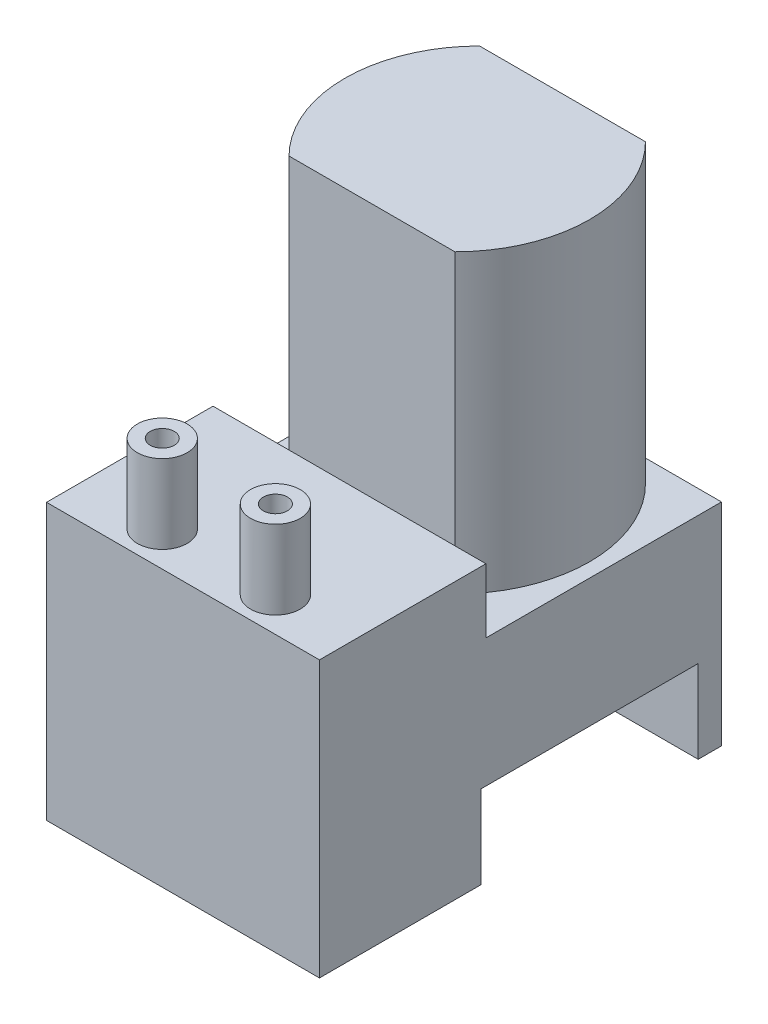
ISO-10303-21;
HEADER;
FILE_DESCRIPTION(('STEP AP214'),'2;1');
FILE_NAME('part.step','',(''),(''),'','','');
FILE_SCHEMA(('AUTOMOTIVE_DESIGN { 1 0 10303 214 1 1 1 1 }'));
ENDSEC;
DATA;
#1=APPLICATION_CONTEXT('core data for automotive mechanical design processes');
#2=APPLICATION_PROTOCOL_DEFINITION('international standard','automotive_design',2000,#1);
#3=PRODUCT_CONTEXT('',#1,'mechanical');
#4=PRODUCT('Part','Part','',(#3));
#5=PRODUCT_RELATED_PRODUCT_CATEGORY('part','',(#4));
#6=PRODUCT_DEFINITION_FORMATION('','',#4);
#7=PRODUCT_DEFINITION_CONTEXT('part definition',#1,'design');
#8=PRODUCT_DEFINITION('design','',#6,#7);
#9=PRODUCT_DEFINITION_SHAPE('','',#8);
#10=(LENGTH_UNIT() NAMED_UNIT(*) SI_UNIT(.MILLI.,.METRE.));
#11=(NAMED_UNIT(*) PLANE_ANGLE_UNIT() SI_UNIT($,.RADIAN.));
#12=(NAMED_UNIT(*) SI_UNIT($,.STERADIAN.) SOLID_ANGLE_UNIT());
#13=UNCERTAINTY_MEASURE_WITH_UNIT(LENGTH_MEASURE(1.E-05),#10,'distance_accuracy_value','');
#14=(GEOMETRIC_REPRESENTATION_CONTEXT(3) GLOBAL_UNCERTAINTY_ASSIGNED_CONTEXT((#13)) GLOBAL_UNIT_ASSIGNED_CONTEXT((#10,
#11,#12)) REPRESENTATION_CONTEXT('',''));
#15=CARTESIAN_POINT('',(0.,0.,0.));
#16=DIRECTION('',(0.,0.,1.));
#17=DIRECTION('',(1.,0.,0.));
#18=AXIS2_PLACEMENT_3D('',#15,#16,#17);
#19=CARTESIAN_POINT('',(8.501,4.58,0.));
#20=DIRECTION('',(0.,-1.,0.));
#21=DIRECTION('',(1.,0.,0.));
#22=AXIS2_PLACEMENT_3D('',#19,#20,#21);
#23=PLANE('',#22);
#24=DIRECTION('',(0.,0.,-1.));
#25=VECTOR('',#24,1.);
#26=CARTESIAN_POINT('',(8.5,4.58,0.));
#27=LINE('',#26,#25);
#28=CARTESIAN_POINT('',(8.5,4.58,14.67));
#29=VERTEX_POINT('',#28);
#30=CARTESIAN_POINT('',(8.5,4.58,0.));
#31=VERTEX_POINT('',#30);
#32=EDGE_CURVE('E221',#29,#31,#27,.T.);
#33=ORIENTED_EDGE('',*,*,#32,.T.);
#34=DIRECTION('',(-1.,0.,0.));
#35=VECTOR('',#34,1.);
#36=CARTESIAN_POINT('',(8.501,4.58,0.));
#37=LINE('',#36,#35);
#38=CARTESIAN_POINT('',(-8.5,4.58,0.));
#39=VERTEX_POINT('',#38);
#40=EDGE_CURVE('E217',#31,#39,#37,.T.);
#41=ORIENTED_EDGE('',*,*,#40,.T.);
#42=DIRECTION('',(0.,0.,1.));
#43=VECTOR('',#42,1.);
#44=CARTESIAN_POINT('',(-8.5,4.58,0.));
#45=LINE('',#44,#43);
#46=CARTESIAN_POINT('',(-8.5,4.58,14.67));
#47=VERTEX_POINT('',#46);
#48=EDGE_CURVE('E212',#39,#47,#45,.T.);
#49=ORIENTED_EDGE('',*,*,#48,.T.);
#50=DIRECTION('',(-1.,0.,0.));
#51=VECTOR('',#50,1.);
#52=CARTESIAN_POINT('',(8.501,4.58,14.67));
#53=LINE('',#52,#51);
#54=EDGE_CURVE('E222',#29,#47,#53,.T.);
#55=ORIENTED_EDGE('',*,*,#54,.F.);
#56=EDGE_LOOP('',(#33,#41,#49,#55));
#57=FACE_BOUND('',#56,.T.);
#58=CARTESIAN_POINT('',(0.770000000000004,4.58,7.335));
#59=DIRECTION('',(0.,1.,0.));
#60=DIRECTION('',(1.,0.,0.));
#61=AXIS2_PLACEMENT_3D('',#58,#59,#60);
#62=CIRCLE('',#61,8.39335749268433);
#63=CARTESIAN_POINT('',(-5.16500000000001,4.58,1.4));
#64=VERTEX_POINT('',#63);
#65=CARTESIAN_POINT('',(-5.165,4.58,13.27));
#66=VERTEX_POINT('',#65);
#67=EDGE_CURVE('E175',#64,#66,#62,.T.);
#68=ORIENTED_EDGE('',*,*,#67,.F.);
#69=DIRECTION('',(-1.,0.,0.));
#70=VECTOR('',#69,1.);
#71=CARTESIAN_POINT('',(5.16499999999999,4.58,1.4));
#72=LINE('',#71,#70);
#73=CARTESIAN_POINT('',(5.165,4.58,1.4));
#74=VERTEX_POINT('',#73);
#75=EDGE_CURVE('E172',#74,#64,#72,.T.);
#76=ORIENTED_EDGE('',*,*,#75,.F.);
#77=CARTESIAN_POINT('',(-0.769999999999997,4.58,7.335));
#78=DIRECTION('',(0.,1.,0.));
#79=DIRECTION('',(-1.,0.,0.));
#80=AXIS2_PLACEMENT_3D('',#77,#78,#79);
#81=CIRCLE('',#80,8.39335749268431);
#82=CARTESIAN_POINT('',(5.165,4.58000000000001,13.27));
#83=VERTEX_POINT('',#82);
#84=EDGE_CURVE('E53',#83,#74,#81,.T.);
#85=ORIENTED_EDGE('',*,*,#84,.F.);
#86=DIRECTION('',(1.,0.,0.));
#87=VECTOR('',#86,1.);
#88=CARTESIAN_POINT('',(5.165,4.58,13.27));
#89=LINE('',#88,#87);
#90=EDGE_CURVE('E48',#66,#83,#89,.T.);
#91=ORIENTED_EDGE('',*,*,#90,.F.);
#92=EDGE_LOOP('',(#68,#76,#85,#91));
#93=FACE_BOUND('',#92,.T.);
#94=ADVANCED_FACE('F33',(#57,#93),#23,.F.);
#95=CARTESIAN_POINT('',(-8.5,-8.58,25.04));
#96=DIRECTION('',(0.,1.,0.));
#97=DIRECTION('',(0.,0.,1.));
#98=AXIS2_PLACEMENT_3D('',#95,#96,#97);
#99=PLANE('',#98);
#100=DIRECTION('',(0.,0.,-1.));
#101=VECTOR('',#100,1.);
#102=CARTESIAN_POINT('',(8.5,-8.58,25.04));
#103=LINE('',#102,#101);
#104=CARTESIAN_POINT('',(8.5,-8.58,1.45));
#105=VERTEX_POINT('',#104);
#106=CARTESIAN_POINT('',(8.5,-8.58,0.));
#107=VERTEX_POINT('',#106);
#108=EDGE_CURVE('E278',#105,#107,#103,.T.);
#109=ORIENTED_EDGE('',*,*,#108,.F.);
#110=DIRECTION('',(1.,0.,0.));
#111=VECTOR('',#110,1.);
#112=CARTESIAN_POINT('',(8.5,-8.58,1.45));
#113=LINE('',#112,#111);
#114=CARTESIAN_POINT('',(-8.5,-8.58,1.45));
#115=VERTEX_POINT('',#114);
#116=EDGE_CURVE('E231',#115,#105,#113,.T.);
#117=ORIENTED_EDGE('',*,*,#116,.F.);
#118=DIRECTION('',(0.,0.,-1.));
#119=VECTOR('',#118,1.);
#120=CARTESIAN_POINT('',(-8.5,-8.58,25.04));
#121=LINE('',#120,#119);
#122=CARTESIAN_POINT('',(-8.5,-8.58,0.));
#123=VERTEX_POINT('',#122);
#124=EDGE_CURVE('E288',#115,#123,#121,.T.);
#125=ORIENTED_EDGE('',*,*,#124,.T.);
#126=DIRECTION('',(1.,0.,0.));
#127=VECTOR('',#126,1.);
#128=CARTESIAN_POINT('',(-8.5,-8.58,0.));
#129=LINE('',#128,#127);
#130=EDGE_CURVE('E272',#123,#107,#129,.T.);
#131=ORIENTED_EDGE('',*,*,#130,.T.);
#132=EDGE_LOOP('',(#109,#117,#125,#131));
#133=FACE_BOUND('',#132,.T.);
#134=ADVANCED_FACE('F345',(#133),#99,.F.);
#135=CARTESIAN_POINT('',(8.5,8.58,25.04));
#136=DIRECTION('',(-1.,0.,0.));
#137=DIRECTION('',(0.,-1.,0.));
#138=AXIS2_PLACEMENT_3D('',#135,#136,#137);
#139=PLANE('',#138);
#140=ORIENTED_EDGE('',*,*,#32,.F.);
#141=DIRECTION('',(0.,-1.,0.));
#142=VECTOR('',#141,1.);
#143=CARTESIAN_POINT('',(8.5,8.58,14.67));
#144=LINE('',#143,#142);
#145=CARTESIAN_POINT('',(8.5,8.58,14.67));
#146=VERTEX_POINT('',#145);
#147=EDGE_CURVE('E205',#146,#29,#144,.T.);
#148=ORIENTED_EDGE('',*,*,#147,.F.);
#149=DIRECTION('',(0.,0.,-1.));
#150=VECTOR('',#149,1.);
#151=CARTESIAN_POINT('',(8.5,8.58,25.04));
#152=LINE('',#151,#150);
#153=CARTESIAN_POINT('',(8.5,8.58,25.04));
#154=VERTEX_POINT('',#153);
#155=EDGE_CURVE('E295',#154,#146,#152,.T.);
#156=ORIENTED_EDGE('',*,*,#155,.F.);
#157=DIRECTION('',(0.,1.,0.));
#158=VECTOR('',#157,1.);
#159=CARTESIAN_POINT('',(8.5,8.58,25.04));
#160=LINE('',#159,#158);
#161=CARTESIAN_POINT('',(8.5,-8.58,25.04));
#162=VERTEX_POINT('',#161);
#163=EDGE_CURVE('E268',#162,#154,#160,.T.);
#164=ORIENTED_EDGE('',*,*,#163,.F.);
#165=CARTESIAN_POINT('',(8.5,-8.58,14.97));
#166=VERTEX_POINT('',#165);
#167=EDGE_CURVE('E285',#162,#166,#103,.T.);
#168=ORIENTED_EDGE('',*,*,#167,.T.);
#169=DIRECTION('',(0.,-1.,0.));
#170=VECTOR('',#169,1.);
#171=CARTESIAN_POINT('',(8.5,-3.41,14.97));
#172=LINE('',#171,#170);
#173=CARTESIAN_POINT('',(8.5,-3.41,14.97));
#174=VERTEX_POINT('',#173);
#175=EDGE_CURVE('E237',#174,#166,#172,.T.);
#176=ORIENTED_EDGE('',*,*,#175,.F.);
#177=DIRECTION('',(0.,0.,1.));
#178=VECTOR('',#177,1.);
#179=CARTESIAN_POINT('',(8.5,-3.41,1.45));
#180=LINE('',#179,#178);
#181=CARTESIAN_POINT('',(8.5,-3.41,1.45));
#182=VERTEX_POINT('',#181);
#183=EDGE_CURVE('E227',#182,#174,#180,.T.);
#184=ORIENTED_EDGE('',*,*,#183,.F.);
#185=DIRECTION('',(0.,-1.,0.));
#186=VECTOR('',#185,1.);
#187=CARTESIAN_POINT('',(8.5,-3.41,1.45));
#188=LINE('',#187,#186);
#189=EDGE_CURVE('E240',#182,#105,#188,.T.);
#190=ORIENTED_EDGE('',*,*,#189,.T.);
#191=ORIENTED_EDGE('',*,*,#108,.T.);
#192=DIRECTION('',(0.,1.,0.));
#193=VECTOR('',#192,1.);
#194=CARTESIAN_POINT('',(8.5,8.58,0.));
#195=LINE('',#194,#193);
#196=EDGE_CURVE('E267',#107,#31,#195,.T.);
#197=ORIENTED_EDGE('',*,*,#196,.T.);
#198=EDGE_LOOP('',(#140,#148,#156,#164,#168,#176,#184,#190,#191,#197));
#199=FACE_BOUND('',#198,.T.);
#200=ADVANCED_FACE('F35',(#199),#139,.F.);
#201=CARTESIAN_POINT('',(-8.5,8.58,25.04));
#202=DIRECTION('',(0.,-1.,0.));
#203=DIRECTION('',(0.,0.,-1.));
#204=AXIS2_PLACEMENT_3D('',#201,#202,#203);
#205=PLANE('',#204);
#206=CARTESIAN_POINT('',(-3.44656333273186,8.58,22.884960512398));
#207=DIRECTION('',(0.,-1.,0.));
#208=DIRECTION('',(0.,0.,-1.));
#209=AXIS2_PLACEMENT_3D('',#206,#207,#208);
#210=CIRCLE('',#209,1.55);
#211=CARTESIAN_POINT('',(-3.44656333273186,8.58,21.334960512398));
#212=VERTEX_POINT('',#211);
#213=EDGE_CURVE('E11',#212,#212,#210,.F.);
#214=ORIENTED_EDGE('',*,*,#213,.F.);
#215=EDGE_LOOP('',(#214));
#216=FACE_BOUND('',#215,.T.);
#217=CARTESIAN_POINT('',(3.61628527304703,8.58,22.901678995054));
#218=DIRECTION('',(0.,-1.,0.));
#219=DIRECTION('',(0.,0.,-1.));
#220=AXIS2_PLACEMENT_3D('',#217,#218,#219);
#221=CIRCLE('',#220,1.55);
#222=CARTESIAN_POINT('',(3.61628527304703,8.58,21.351678995054));
#223=VERTEX_POINT('',#222);
#224=EDGE_CURVE('E41',#223,#223,#221,.F.);
#225=ORIENTED_EDGE('',*,*,#224,.F.);
#226=EDGE_LOOP('',(#225));
#227=FACE_BOUND('',#226,.T.);
#228=ORIENTED_EDGE('',*,*,#155,.T.);
#229=DIRECTION('',(-1.,0.,0.));
#230=VECTOR('',#229,1.);
#231=CARTESIAN_POINT('',(8.501,8.58,14.67));
#232=LINE('',#231,#230);
#233=CARTESIAN_POINT('',(-8.5,8.58,14.67));
#234=VERTEX_POINT('',#233);
#235=EDGE_CURVE('E218',#146,#234,#232,.T.);
#236=ORIENTED_EDGE('',*,*,#235,.T.);
#237=DIRECTION('',(0.,0.,-1.));
#238=VECTOR('',#237,1.);
#239=CARTESIAN_POINT('',(-8.5,8.58,25.04));
#240=LINE('',#239,#238);
#241=CARTESIAN_POINT('',(-8.5,8.58,25.04));
#242=VERTEX_POINT('',#241);
#243=EDGE_CURVE('E292',#242,#234,#240,.T.);
#244=ORIENTED_EDGE('',*,*,#243,.F.);
#245=DIRECTION('',(-1.,0.,0.));
#246=VECTOR('',#245,1.);
#247=CARTESIAN_POINT('',(-8.5,8.58,25.04));
#248=LINE('',#247,#246);
#249=EDGE_CURVE('E271',#154,#242,#248,.T.);
#250=ORIENTED_EDGE('',*,*,#249,.F.);
#251=EDGE_LOOP('',(#228,#236,#244,#250));
#252=FACE_BOUND('',#251,.T.);
#253=ADVANCED_FACE('F302',(#216,#227,#252),#205,.F.);
#254=CARTESIAN_POINT('',(-8.5,8.58,25.04));
#255=DIRECTION('',(1.,0.,0.));
#256=DIRECTION('',(0.,1.,0.));
#257=AXIS2_PLACEMENT_3D('',#254,#255,#256);
#258=PLANE('',#257);
#259=DIRECTION('',(0.,-1.,0.));
#260=VECTOR('',#259,1.);
#261=CARTESIAN_POINT('',(-8.5,-3.41,1.45));
#262=LINE('',#261,#260);
#263=CARTESIAN_POINT('',(-8.5,2.23,1.45));
#264=VERTEX_POINT('',#263);
#265=EDGE_CURVE('E244',#264,#115,#262,.T.);
#266=ORIENTED_EDGE('',*,*,#265,.F.);
#267=DIRECTION('',(0.,0.,-1.));
#268=VECTOR('',#267,1.);
#269=CARTESIAN_POINT('',(-8.5,2.23,1.45));
#270=LINE('',#269,#268);
#271=CARTESIAN_POINT('',(-8.5,2.23,14.99));
#272=VERTEX_POINT('',#271);
#273=EDGE_CURVE('E187',#272,#264,#270,.T.);
#274=ORIENTED_EDGE('',*,*,#273,.F.);
#275=DIRECTION('',(0.,1.,0.));
#276=VECTOR('',#275,1.);
#277=CARTESIAN_POINT('',(-8.5,-3.41,14.99));
#278=LINE('',#277,#276);
#279=CARTESIAN_POINT('',(-8.5,-3.41,14.99));
#280=VERTEX_POINT('',#279);
#281=EDGE_CURVE('E178',#280,#272,#278,.T.);
#282=ORIENTED_EDGE('',*,*,#281,.F.);
#283=DIRECTION('',(0.,0.,1.));
#284=VECTOR('',#283,1.);
#285=CARTESIAN_POINT('',(-8.5,-3.41,1.45));
#286=LINE('',#285,#284);
#287=CARTESIAN_POINT('',(-8.5,-3.41,14.97));
#288=VERTEX_POINT('',#287);
#289=EDGE_CURVE('E176',#288,#280,#286,.T.);
#290=ORIENTED_EDGE('',*,*,#289,.F.);
#291=DIRECTION('',(0.,-1.,0.));
#292=VECTOR('',#291,1.);
#293=CARTESIAN_POINT('',(-8.5,-3.41,14.97));
#294=LINE('',#293,#292);
#295=CARTESIAN_POINT('',(-8.5,-8.58,14.97));
#296=VERTEX_POINT('',#295);
#297=EDGE_CURVE('E246',#288,#296,#294,.T.);
#298=ORIENTED_EDGE('',*,*,#297,.T.);
#299=CARTESIAN_POINT('',(-8.5,-8.58,25.04));
#300=VERTEX_POINT('',#299);
#301=EDGE_CURVE('E289',#300,#296,#121,.T.);
#302=ORIENTED_EDGE('',*,*,#301,.F.);
#303=DIRECTION('',(0.,-1.,0.));
#304=VECTOR('',#303,1.);
#305=CARTESIAN_POINT('',(-8.5,8.58,25.04));
#306=LINE('',#305,#304);
#307=EDGE_CURVE('E274',#242,#300,#306,.T.);
#308=ORIENTED_EDGE('',*,*,#307,.F.);
#309=ORIENTED_EDGE('',*,*,#243,.T.);
#310=DIRECTION('',(0.,1.,0.));
#311=VECTOR('',#310,1.);
#312=CARTESIAN_POINT('',(-8.5,8.58,14.67));
#313=LINE('',#312,#311);
#314=EDGE_CURVE('E215',#47,#234,#313,.T.);
#315=ORIENTED_EDGE('',*,*,#314,.F.);
#316=ORIENTED_EDGE('',*,*,#48,.F.);
#317=DIRECTION('',(0.,-1.,0.));
#318=VECTOR('',#317,1.);
#319=CARTESIAN_POINT('',(-8.5,8.58,0.));
#320=LINE('',#319,#318);
#321=EDGE_CURVE('E281',#39,#123,#320,.T.);
#322=ORIENTED_EDGE('',*,*,#321,.T.);
#323=ORIENTED_EDGE('',*,*,#124,.F.);
#324=EDGE_LOOP('',(#266,#274,#282,#290,#298,#302,#308,#309,#315,#316,#322,#323));
#325=FACE_BOUND('',#324,.T.);
#326=ADVANCED_FACE('F305',(#325),#258,.F.);
#327=ORIENTED_EDGE('',*,*,#301,.T.);
#328=DIRECTION('',(-1.,0.,0.));
#329=VECTOR('',#328,1.);
#330=CARTESIAN_POINT('',(8.5,-8.58,14.97));
#331=LINE('',#330,#329);
#332=EDGE_CURVE('E226',#166,#296,#331,.T.);
#333=ORIENTED_EDGE('',*,*,#332,.F.);
#334=ORIENTED_EDGE('',*,*,#167,.F.);
#335=DIRECTION('',(1.,0.,0.));
#336=VECTOR('',#335,1.);
#337=CARTESIAN_POINT('',(-8.5,-8.58,25.04));
#338=LINE('',#337,#336);
#339=EDGE_CURVE('E276',#300,#162,#338,.T.);
#340=ORIENTED_EDGE('',*,*,#339,.F.);
#341=EDGE_LOOP('',(#327,#333,#334,#340));
#342=FACE_BOUND('',#341,.T.);
#343=ADVANCED_FACE('F327',(#342),#99,.F.);
#344=CARTESIAN_POINT('',(0.,0.,25.04));
#345=DIRECTION('',(0.,0.,1.));
#346=DIRECTION('',(1.,0.,0.));
#347=AXIS2_PLACEMENT_3D('',#344,#345,#346);
#348=PLANE('',#347);
#349=ORIENTED_EDGE('',*,*,#163,.T.);
#350=ORIENTED_EDGE('',*,*,#249,.T.);
#351=ORIENTED_EDGE('',*,*,#307,.T.);
#352=ORIENTED_EDGE('',*,*,#339,.T.);
#353=EDGE_LOOP('',(#349,#350,#351,#352));
#354=FACE_BOUND('',#353,.T.);
#355=ADVANCED_FACE('F323',(#354),#348,.T.);
#356=CARTESIAN_POINT('',(0.,0.,0.));
#357=DIRECTION('',(0.,0.,1.));
#358=DIRECTION('',(1.,0.,0.));
#359=AXIS2_PLACEMENT_3D('',#356,#357,#358);
#360=PLANE('',#359);
#361=ORIENTED_EDGE('',*,*,#321,.F.);
#362=ORIENTED_EDGE('',*,*,#40,.F.);
#363=ORIENTED_EDGE('',*,*,#196,.F.);
#364=ORIENTED_EDGE('',*,*,#130,.F.);
#365=EDGE_LOOP('',(#361,#362,#363,#364));
#366=FACE_BOUND('',#365,.T.);
#367=ADVANCED_FACE('F352',(#366),#360,.F.);
#368=CARTESIAN_POINT('',(3.61628527304703,13.48,22.901678995054));
#369=DIRECTION('',(0.,-1.,0.));
#370=DIRECTION('',(0.,0.,-1.));
#371=AXIS2_PLACEMENT_3D('',#368,#369,#370);
#372=CYLINDRICAL_SURFACE('',#371,1.55);
#373=CARTESIAN_POINT('',(3.61628527304703,13.48,22.901678995054));
#374=DIRECTION('',(0.,1.,0.));
#375=DIRECTION('',(0.,0.,1.));
#376=AXIS2_PLACEMENT_3D('',#373,#374,#375);
#377=CIRCLE('',#376,1.55);
#378=CARTESIAN_POINT('',(3.61628527304703,13.48,24.451678995054));
#379=VERTEX_POINT('',#378);
#380=EDGE_CURVE('E264',#379,#379,#377,.T.);
#381=ORIENTED_EDGE('',*,*,#380,.F.);
#382=EDGE_LOOP('',(#381));
#383=FACE_BOUND('',#382,.T.);
#384=ORIENTED_EDGE('',*,*,#224,.T.);
#385=EDGE_LOOP('',(#384));
#386=FACE_BOUND('',#385,.T.);
#387=ADVANCED_FACE('F300',(#383,#386),#372,.T.);
#388=CARTESIAN_POINT('',(3.61628527304703,13.48,22.901678995054));
#389=DIRECTION('',(0.,1.,0.));
#390=DIRECTION('',(0.,0.,1.));
#391=AXIS2_PLACEMENT_3D('',#388,#389,#390);
#392=PLANE('',#391);
#393=CARTESIAN_POINT('',(3.61628527304703,13.48,22.901678995054));
#394=DIRECTION('',(0.,1.,0.));
#395=DIRECTION('',(0.,0.,1.));
#396=AXIS2_PLACEMENT_3D('',#393,#394,#395);
#397=CIRCLE('',#396,0.75);
#398=CARTESIAN_POINT('',(3.61628527304703,13.48,23.651678995054));
#399=VERTEX_POINT('',#398);
#400=EDGE_CURVE('E253',#399,#399,#397,.T.);
#401=ORIENTED_EDGE('',*,*,#400,.F.);
#402=EDGE_LOOP('',(#401));
#403=FACE_BOUND('',#402,.T.);
#404=ORIENTED_EDGE('',*,*,#380,.T.);
#405=EDGE_LOOP('',(#404));
#406=FACE_BOUND('',#405,.T.);
#407=ADVANCED_FACE('F430',(#403,#406),#392,.T.);
#408=CARTESIAN_POINT('',(-3.44656333273186,13.48,22.884960512398));
#409=DIRECTION('',(0.,-1.,0.));
#410=DIRECTION('',(0.,0.,-1.));
#411=AXIS2_PLACEMENT_3D('',#408,#409,#410);
#412=CYLINDRICAL_SURFACE('',#411,1.55);
#413=CARTESIAN_POINT('',(-3.44656333273186,13.48,22.884960512398));
#414=DIRECTION('',(0.,1.,0.));
#415=DIRECTION('',(0.,0.,1.));
#416=AXIS2_PLACEMENT_3D('',#413,#414,#415);
#417=CIRCLE('',#416,1.55);
#418=CARTESIAN_POINT('',(-3.44656333273186,13.48,24.434960512398));
#419=VERTEX_POINT('',#418);
#420=EDGE_CURVE('E259',#419,#419,#417,.T.);
#421=ORIENTED_EDGE('',*,*,#420,.F.);
#422=EDGE_LOOP('',(#421));
#423=FACE_BOUND('',#422,.T.);
#424=ORIENTED_EDGE('',*,*,#213,.T.);
#425=EDGE_LOOP('',(#424));
#426=FACE_BOUND('',#425,.T.);
#427=ADVANCED_FACE('F426',(#423,#426),#412,.T.);
#428=CARTESIAN_POINT('',(-3.44656333273186,13.48,22.884960512398));
#429=DIRECTION('',(0.,1.,0.));
#430=DIRECTION('',(0.,0.,1.));
#431=AXIS2_PLACEMENT_3D('',#428,#429,#430);
#432=PLANE('',#431);
#433=CARTESIAN_POINT('',(-3.44656333273186,13.48,22.884960512398));
#434=DIRECTION('',(0.,1.,0.));
#435=DIRECTION('',(0.,0.,1.));
#436=AXIS2_PLACEMENT_3D('',#433,#434,#435);
#437=CIRCLE('',#436,0.75);
#438=CARTESIAN_POINT('',(-3.44656333273186,13.48,23.634960512398));
#439=VERTEX_POINT('',#438);
#440=EDGE_CURVE('E243',#439,#439,#437,.T.);
#441=ORIENTED_EDGE('',*,*,#440,.F.);
#442=EDGE_LOOP('',(#441));
#443=FACE_BOUND('',#442,.T.);
#444=ORIENTED_EDGE('',*,*,#420,.T.);
#445=EDGE_LOOP('',(#444));
#446=FACE_BOUND('',#445,.T.);
#447=ADVANCED_FACE('F422',(#443,#446),#432,.T.);
#448=CARTESIAN_POINT('',(3.61628527304703,8.58,22.901678995054));
#449=DIRECTION('',(0.,1.,0.));
#450=DIRECTION('',(0.,0.,1.));
#451=AXIS2_PLACEMENT_3D('',#448,#449,#450);
#452=CYLINDRICAL_SURFACE('',#451,0.75);
#453=CARTESIAN_POINT('',(3.61628527304703,8.58,22.901678995054));
#454=DIRECTION('',(0.,1.,0.));
#455=DIRECTION('',(0.,0.,1.));
#456=AXIS2_PLACEMENT_3D('',#453,#454,#455);
#457=CIRCLE('',#456,0.75);
#458=CARTESIAN_POINT('',(3.61628527304703,8.58,23.651678995054));
#459=VERTEX_POINT('',#458);
#460=EDGE_CURVE('E256',#459,#459,#457,.T.);
#461=ORIENTED_EDGE('',*,*,#460,.F.);
#462=EDGE_LOOP('',(#461));
#463=FACE_BOUND('',#462,.T.);
#464=ORIENTED_EDGE('',*,*,#400,.T.);
#465=EDGE_LOOP('',(#464));
#466=FACE_BOUND('',#465,.T.);
#467=ADVANCED_FACE('F418',(#463,#466),#452,.F.);
#468=CARTESIAN_POINT('',(3.61628527304703,8.58,22.901678995054));
#469=DIRECTION('',(0.,1.,0.));
#470=DIRECTION('',(0.,0.,1.));
#471=AXIS2_PLACEMENT_3D('',#468,#469,#470);
#472=PLANE('',#471);
#473=ORIENTED_EDGE('',*,*,#460,.T.);
#474=EDGE_LOOP('',(#473));
#475=FACE_BOUND('',#474,.T.);
#476=ADVANCED_FACE('F414',(#475),#472,.T.);
#477=CARTESIAN_POINT('',(-3.44656333273186,8.58,22.884960512398));
#478=DIRECTION('',(0.,1.,0.));
#479=DIRECTION('',(0.,0.,1.));
#480=AXIS2_PLACEMENT_3D('',#477,#478,#479);
#481=CYLINDRICAL_SURFACE('',#480,0.75);
#482=CARTESIAN_POINT('',(-3.44656333273186,8.58,22.884960512398));
#483=DIRECTION('',(0.,1.,0.));
#484=DIRECTION('',(0.,0.,1.));
#485=AXIS2_PLACEMENT_3D('',#482,#483,#484);
#486=CIRCLE('',#485,0.75);
#487=CARTESIAN_POINT('',(-3.44656333273186,8.58,23.634960512398));
#488=VERTEX_POINT('',#487);
#489=EDGE_CURVE('E250',#488,#488,#486,.T.);
#490=ORIENTED_EDGE('',*,*,#489,.F.);
#491=EDGE_LOOP('',(#490));
#492=FACE_BOUND('',#491,.T.);
#493=ORIENTED_EDGE('',*,*,#440,.T.);
#494=EDGE_LOOP('',(#493));
#495=FACE_BOUND('',#494,.T.);
#496=ADVANCED_FACE('F410',(#492,#495),#481,.F.);
#497=CARTESIAN_POINT('',(-3.44656333273186,8.58,22.884960512398));
#498=DIRECTION('',(0.,1.,0.));
#499=DIRECTION('',(0.,0.,1.));
#500=AXIS2_PLACEMENT_3D('',#497,#498,#499);
#501=PLANE('',#500);
#502=ORIENTED_EDGE('',*,*,#489,.T.);
#503=EDGE_LOOP('',(#502));
#504=FACE_BOUND('',#503,.T.);
#505=ADVANCED_FACE('F405',(#504),#501,.T.);
#506=CARTESIAN_POINT('',(8.5,-3.41,1.45));
#507=DIRECTION('',(0.,0.,-1.));
#508=DIRECTION('',(-1.,0.,0.));
#509=AXIS2_PLACEMENT_3D('',#506,#507,#508);
#510=PLANE('',#509);
#511=ORIENTED_EDGE('',*,*,#116,.T.);
#512=ORIENTED_EDGE('',*,*,#189,.F.);
#513=DIRECTION('',(1.,0.,0.));
#514=VECTOR('',#513,1.);
#515=CARTESIAN_POINT('',(8.5,-3.41,1.45));
#516=LINE('',#515,#514);
#517=CARTESIAN_POINT('',(6.51,-3.41,1.45));
#518=VERTEX_POINT('',#517);
#519=EDGE_CURVE('E235',#518,#182,#516,.T.);
#520=ORIENTED_EDGE('',*,*,#519,.F.);
#521=DIRECTION('',(0.,-1.,0.));
#522=VECTOR('',#521,1.);
#523=CARTESIAN_POINT('',(6.51,-3.41,1.45));
#524=LINE('',#523,#522);
#525=CARTESIAN_POINT('',(6.51,2.23,1.45));
#526=VERTEX_POINT('',#525);
#527=EDGE_CURVE('E184',#526,#518,#524,.T.);
#528=ORIENTED_EDGE('',*,*,#527,.F.);
#529=DIRECTION('',(-1.,0.,0.));
#530=VECTOR('',#529,1.);
#531=CARTESIAN_POINT('',(6.51,2.23,1.45));
#532=LINE('',#531,#530);
#533=EDGE_CURVE('E202',#526,#264,#532,.T.);
#534=ORIENTED_EDGE('',*,*,#533,.T.);
#535=ORIENTED_EDGE('',*,*,#265,.T.);
#536=EDGE_LOOP('',(#511,#512,#520,#528,#534,#535));
#537=FACE_BOUND('',#536,.T.);
#538=ADVANCED_FACE('F341',(#537),#510,.F.);
#539=CARTESIAN_POINT('',(8.5,-3.41,14.97));
#540=DIRECTION('',(0.,0.,1.));
#541=DIRECTION('',(1.,0.,0.));
#542=AXIS2_PLACEMENT_3D('',#539,#540,#541);
#543=PLANE('',#542);
#544=ORIENTED_EDGE('',*,*,#332,.T.);
#545=ORIENTED_EDGE('',*,*,#297,.F.);
#546=DIRECTION('',(-1.,0.,0.));
#547=VECTOR('',#546,1.);
#548=CARTESIAN_POINT('',(8.5,-3.41,14.97));
#549=LINE('',#548,#547);
#550=CARTESIAN_POINT('',(6.51,-3.41,14.97));
#551=VERTEX_POINT('',#550);
#552=EDGE_CURVE('E230',#551,#288,#549,.T.);
#553=ORIENTED_EDGE('',*,*,#552,.F.);
#554=EDGE_CURVE('E232',#174,#551,#549,.T.);
#555=ORIENTED_EDGE('',*,*,#554,.F.);
#556=ORIENTED_EDGE('',*,*,#175,.T.);
#557=EDGE_LOOP('',(#544,#545,#553,#555,#556));
#558=FACE_BOUND('',#557,.T.);
#559=ADVANCED_FACE('F331',(#558),#543,.F.);
#560=CARTESIAN_POINT('',(0.,-3.41,0.));
#561=DIRECTION('',(0.,-1.,0.));
#562=DIRECTION('',(0.,0.,-1.));
#563=AXIS2_PLACEMENT_3D('',#560,#561,#562);
#564=PLANE('',#563);
#565=DIRECTION('',(0.,0.,1.));
#566=VECTOR('',#565,1.);
#567=CARTESIAN_POINT('',(6.51,-3.41,1.45));
#568=LINE('',#567,#566);
#569=EDGE_CURVE('E188',#518,#551,#568,.T.);
#570=ORIENTED_EDGE('',*,*,#569,.F.);
#571=ORIENTED_EDGE('',*,*,#519,.T.);
#572=ORIENTED_EDGE('',*,*,#183,.T.);
#573=ORIENTED_EDGE('',*,*,#554,.T.);
#574=EDGE_LOOP('',(#570,#571,#572,#573));
#575=FACE_BOUND('',#574,.T.);
#576=ADVANCED_FACE('F336',(#575),#564,.T.);
#577=CARTESIAN_POINT('',(8.501,8.58,14.67));
#578=DIRECTION('',(0.,0.,1.));
#579=DIRECTION('',(1.,0.,0.));
#580=AXIS2_PLACEMENT_3D('',#577,#578,#579);
#581=PLANE('',#580);
#582=ORIENTED_EDGE('',*,*,#147,.T.);
#583=ORIENTED_EDGE('',*,*,#54,.T.);
#584=ORIENTED_EDGE('',*,*,#314,.T.);
#585=ORIENTED_EDGE('',*,*,#235,.F.);
#586=EDGE_LOOP('',(#582,#583,#584,#585));
#587=FACE_BOUND('',#586,.T.);
#588=ADVANCED_FACE('F314',(#587),#581,.F.);
#589=CARTESIAN_POINT('',(6.51,-3.41,1.45));
#590=DIRECTION('',(0.,-1.,0.));
#591=DIRECTION('',(1.,0.,0.));
#592=AXIS2_PLACEMENT_3D('',#589,#590,#591);
#593=PLANE('',#592);
#594=ORIENTED_EDGE('',*,*,#289,.T.);
#595=DIRECTION('',(-1.,0.,0.));
#596=VECTOR('',#595,1.);
#597=CARTESIAN_POINT('',(6.51,-3.41,14.99));
#598=LINE('',#597,#596);
#599=CARTESIAN_POINT('',(6.51,-3.41,14.99));
#600=VERTEX_POINT('',#599);
#601=EDGE_CURVE('E196',#600,#280,#598,.T.);
#602=ORIENTED_EDGE('',*,*,#601,.F.);
#603=EDGE_CURVE('E186',#551,#600,#568,.T.);
#604=ORIENTED_EDGE('',*,*,#603,.F.);
#605=ORIENTED_EDGE('',*,*,#552,.T.);
#606=EDGE_LOOP('',(#594,#602,#604,#605));
#607=FACE_BOUND('',#606,.T.);
#608=ADVANCED_FACE('F391',(#607),#593,.F.);
#609=CARTESIAN_POINT('',(6.51,2.23,1.45));
#610=DIRECTION('',(0.,1.,0.));
#611=DIRECTION('',(-1.,0.,0.));
#612=AXIS2_PLACEMENT_3D('',#609,#610,#611);
#613=PLANE('',#612);
#614=ORIENTED_EDGE('',*,*,#273,.T.);
#615=ORIENTED_EDGE('',*,*,#533,.F.);
#616=DIRECTION('',(0.,0.,-1.));
#617=VECTOR('',#616,1.);
#618=CARTESIAN_POINT('',(6.51,2.23,1.45));
#619=LINE('',#618,#617);
#620=CARTESIAN_POINT('',(6.51,2.23,14.99));
#621=VERTEX_POINT('',#620);
#622=EDGE_CURVE('E194',#621,#526,#619,.T.);
#623=ORIENTED_EDGE('',*,*,#622,.F.);
#624=DIRECTION('',(-1.,0.,0.));
#625=VECTOR('',#624,1.);
#626=CARTESIAN_POINT('',(6.51,2.23,14.99));
#627=LINE('',#626,#625);
#628=EDGE_CURVE('E206',#621,#272,#627,.T.);
#629=ORIENTED_EDGE('',*,*,#628,.T.);
#630=EDGE_LOOP('',(#614,#615,#623,#629));
#631=FACE_BOUND('',#630,.T.);
#632=ADVANCED_FACE('F388',(#631),#613,.F.);
#633=CARTESIAN_POINT('',(6.51,-3.41,14.99));
#634=DIRECTION('',(0.,0.,1.));
#635=DIRECTION('',(1.,0.,0.));
#636=AXIS2_PLACEMENT_3D('',#633,#634,#635);
#637=PLANE('',#636);
#638=ORIENTED_EDGE('',*,*,#281,.T.);
#639=ORIENTED_EDGE('',*,*,#628,.F.);
#640=DIRECTION('',(0.,1.,0.));
#641=VECTOR('',#640,1.);
#642=CARTESIAN_POINT('',(6.51,-3.41,14.99));
#643=LINE('',#642,#641);
#644=EDGE_CURVE('E191',#600,#621,#643,.T.);
#645=ORIENTED_EDGE('',*,*,#644,.F.);
#646=ORIENTED_EDGE('',*,*,#601,.T.);
#647=EDGE_LOOP('',(#638,#639,#645,#646));
#648=FACE_BOUND('',#647,.T.);
#649=ADVANCED_FACE('F386',(#648),#637,.F.);
#650=CARTESIAN_POINT('',(6.51,0.,0.));
#651=DIRECTION('',(1.,0.,0.));
#652=DIRECTION('',(0.,0.,-1.));
#653=AXIS2_PLACEMENT_3D('',#650,#651,#652);
#654=PLANE('',#653);
#655=ORIENTED_EDGE('',*,*,#527,.T.);
#656=ORIENTED_EDGE('',*,*,#569,.T.);
#657=ORIENTED_EDGE('',*,*,#603,.T.);
#658=ORIENTED_EDGE('',*,*,#644,.T.);
#659=ORIENTED_EDGE('',*,*,#622,.T.);
#660=EDGE_LOOP('',(#655,#656,#657,#658,#659));
#661=FACE_BOUND('',#660,.T.);
#662=ADVANCED_FACE('F383',(#661),#654,.F.);
#663=CARTESIAN_POINT('',(0.770000000000002,23.04,7.335));
#664=DIRECTION('',(0.,-1.,0.));
#665=DIRECTION('',(1.,0.,0.));
#666=AXIS2_PLACEMENT_3D('',#663,#664,#665);
#667=CYLINDRICAL_SURFACE('',#666,8.39335749268433);
#668=ORIENTED_EDGE('',*,*,#67,.T.);
#669=DIRECTION('',(0.,-1.,0.));
#670=VECTOR('',#669,1.);
#671=CARTESIAN_POINT('',(-5.165,23.04,13.27));
#672=LINE('',#671,#670);
#673=CARTESIAN_POINT('',(-5.165,23.04,13.27));
#674=VERTEX_POINT('',#673);
#675=EDGE_CURVE('E156',#674,#66,#672,.T.);
#676=ORIENTED_EDGE('',*,*,#675,.F.);
#677=CARTESIAN_POINT('',(0.770000000000002,23.04,7.335));
#678=DIRECTION('',(0.,1.,0.));
#679=DIRECTION('',(1.,0.,0.));
#680=AXIS2_PLACEMENT_3D('',#677,#678,#679);
#681=CIRCLE('',#680,8.39335749268433);
#682=CARTESIAN_POINT('',(-5.16500000000001,23.04,1.4));
#683=VERTEX_POINT('',#682);
#684=EDGE_CURVE('E163',#683,#674,#681,.T.);
#685=ORIENTED_EDGE('',*,*,#684,.F.);
#686=DIRECTION('',(0.,-1.,0.));
#687=VECTOR('',#686,1.);
#688=CARTESIAN_POINT('',(-5.16500000000001,23.04,1.4));
#689=LINE('',#688,#687);
#690=EDGE_CURVE('E361',#683,#64,#689,.T.);
#691=ORIENTED_EDGE('',*,*,#690,.T.);
#692=EDGE_LOOP('',(#668,#676,#685,#691));
#693=FACE_BOUND('',#692,.T.);
#694=ADVANCED_FACE('F174',(#693),#667,.T.);
#695=CARTESIAN_POINT('',(5.165,23.04,13.27));
#696=DIRECTION('',(0.,0.,-1.));
#697=DIRECTION('',(-1.,0.,0.));
#698=AXIS2_PLACEMENT_3D('',#695,#696,#697);
#699=PLANE('',#698);
#700=ORIENTED_EDGE('',*,*,#90,.T.);
#701=DIRECTION('',(0.,-1.,0.));
#702=VECTOR('',#701,1.);
#703=CARTESIAN_POINT('',(5.165,23.04,13.27));
#704=LINE('',#703,#702);
#705=CARTESIAN_POINT('',(5.165,23.04,13.27));
#706=VERTEX_POINT('',#705);
#707=EDGE_CURVE('E159',#706,#83,#704,.T.);
#708=ORIENTED_EDGE('',*,*,#707,.F.);
#709=DIRECTION('',(1.,0.,0.));
#710=VECTOR('',#709,1.);
#711=CARTESIAN_POINT('',(5.165,23.04,13.27));
#712=LINE('',#711,#710);
#713=EDGE_CURVE('E152',#674,#706,#712,.T.);
#714=ORIENTED_EDGE('',*,*,#713,.F.);
#715=ORIENTED_EDGE('',*,*,#675,.T.);
#716=EDGE_LOOP('',(#700,#708,#714,#715));
#717=FACE_BOUND('',#716,.T.);
#718=ADVANCED_FACE('F154',(#717),#699,.F.);
#719=CARTESIAN_POINT('',(-0.769999999999999,23.04,7.335));
#720=DIRECTION('',(0.,-1.,0.));
#721=DIRECTION('',(1.,0.,0.));
#722=AXIS2_PLACEMENT_3D('',#719,#720,#721);
#723=CYLINDRICAL_SURFACE('',#722,8.39335749268431);
#724=ORIENTED_EDGE('',*,*,#84,.T.);
#725=DIRECTION('',(0.,-1.,0.));
#726=VECTOR('',#725,1.);
#727=CARTESIAN_POINT('',(5.165,23.04,1.4));
#728=LINE('',#727,#726);
#729=CARTESIAN_POINT('',(5.165,23.04,1.4));
#730=VERTEX_POINT('',#729);
#731=EDGE_CURVE('E180',#730,#74,#728,.T.);
#732=ORIENTED_EDGE('',*,*,#731,.F.);
#733=CARTESIAN_POINT('',(-0.769999999999999,23.04,7.335));
#734=DIRECTION('',(0.,1.,0.));
#735=DIRECTION('',(-1.,0.,0.));
#736=AXIS2_PLACEMENT_3D('',#733,#734,#735);
#737=CIRCLE('',#736,8.39335749268431);
#738=EDGE_CURVE('E162',#706,#730,#737,.T.);
#739=ORIENTED_EDGE('',*,*,#738,.F.);
#740=ORIENTED_EDGE('',*,*,#707,.T.);
#741=EDGE_LOOP('',(#724,#732,#739,#740));
#742=FACE_BOUND('',#741,.T.);
#743=ADVANCED_FACE('F370',(#742),#723,.T.);
#744=CARTESIAN_POINT('',(5.16499999999999,23.04,1.4));
#745=DIRECTION('',(0.,0.,1.));
#746=DIRECTION('',(1.,0.,0.));
#747=AXIS2_PLACEMENT_3D('',#744,#745,#746);
#748=PLANE('',#747);
#749=ORIENTED_EDGE('',*,*,#75,.T.);
#750=ORIENTED_EDGE('',*,*,#690,.F.);
#751=DIRECTION('',(-1.,0.,0.));
#752=VECTOR('',#751,1.);
#753=CARTESIAN_POINT('',(5.16499999999999,23.04,1.4));
#754=LINE('',#753,#752);
#755=EDGE_CURVE('E168',#730,#683,#754,.T.);
#756=ORIENTED_EDGE('',*,*,#755,.F.);
#757=ORIENTED_EDGE('',*,*,#731,.T.);
#758=EDGE_LOOP('',(#749,#750,#756,#757));
#759=FACE_BOUND('',#758,.T.);
#760=ADVANCED_FACE('F360',(#759),#748,.F.);
#761=CARTESIAN_POINT('',(0.770000000000002,23.04,7.335));
#762=DIRECTION('',(0.,-1.,0.));
#763=DIRECTION('',(1.,0.,0.));
#764=AXIS2_PLACEMENT_3D('',#761,#762,#763);
#765=PLANE('',#764);
#766=ORIENTED_EDGE('',*,*,#684,.T.);
#767=ORIENTED_EDGE('',*,*,#713,.T.);
#768=ORIENTED_EDGE('',*,*,#738,.T.);
#769=ORIENTED_EDGE('',*,*,#755,.T.);
#770=EDGE_LOOP('',(#766,#767,#768,#769));
#771=FACE_BOUND('',#770,.T.);
#772=ADVANCED_FACE('F166',(#771),#765,.F.);
#773=CLOSED_SHELL('',(#94,#134,#200,#253,#326,#343,#355,#367,#387,#407,#427,#447,#467,#476,#496,
#505,#538,#559,#576,#588,#608,#632,#649,#662,#694,#718,#743,#760,#772));
#774=MANIFOLD_SOLID_BREP('B2',#773);
#775=ADVANCED_BREP_SHAPE_REPRESENTATION('',(#18,#774),#14);
#776=SHAPE_DEFINITION_REPRESENTATION(#9,#775);
ENDSEC;
END-ISO-10303-21;
